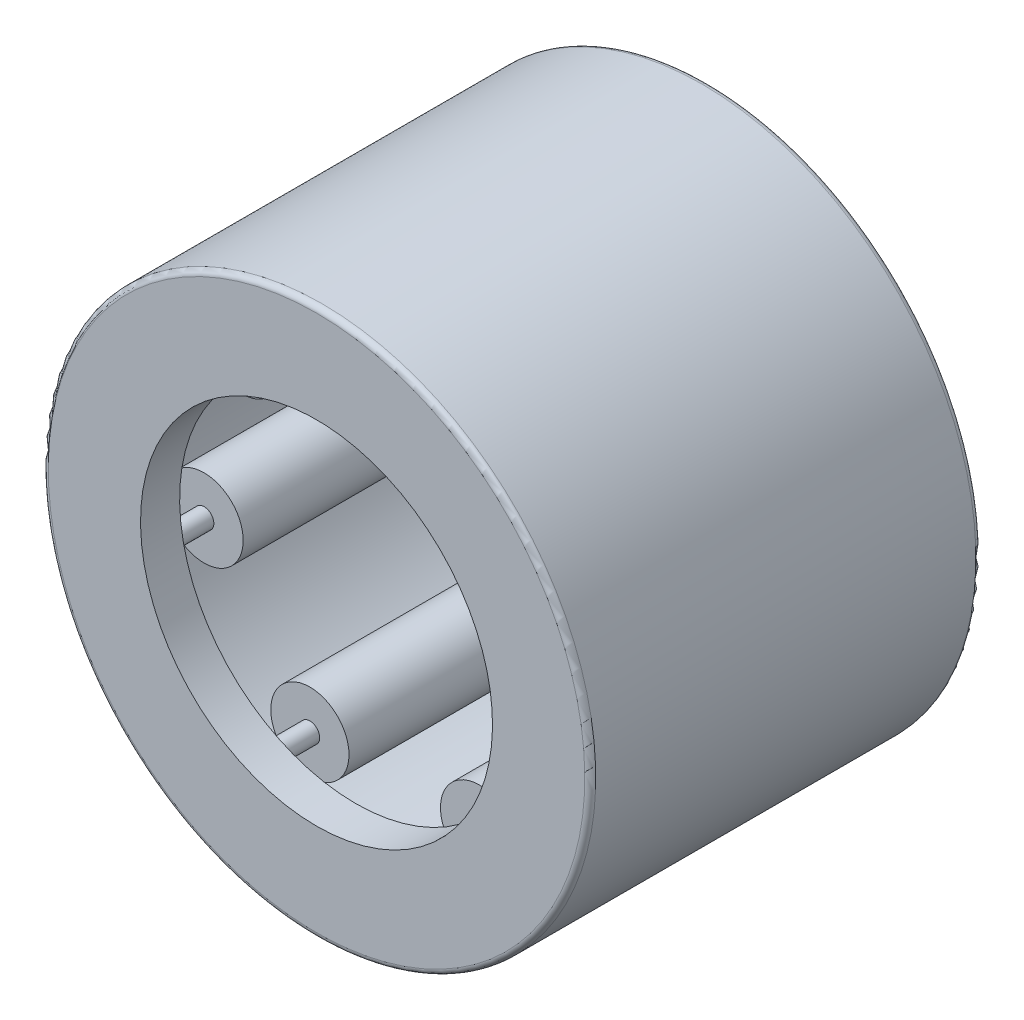
ISO-10303-21;
HEADER;
FILE_DESCRIPTION(('STEP AP214'),'2;1');
FILE_NAME('part.step','',(''),(''),'','','');
FILE_SCHEMA(('AUTOMOTIVE_DESIGN { 1 0 10303 214 1 1 1 1 }'));
ENDSEC;
DATA;
#1=APPLICATION_CONTEXT('core data for automotive mechanical design processes');
#2=APPLICATION_PROTOCOL_DEFINITION('international standard','automotive_design',2000,#1);
#3=PRODUCT_CONTEXT('',#1,'mechanical');
#4=PRODUCT('Part','Part','',(#3));
#5=PRODUCT_RELATED_PRODUCT_CATEGORY('part','',(#4));
#6=PRODUCT_DEFINITION_FORMATION('','',#4);
#7=PRODUCT_DEFINITION_CONTEXT('part definition',#1,'design');
#8=PRODUCT_DEFINITION('design','',#6,#7);
#9=PRODUCT_DEFINITION_SHAPE('','',#8);
#10=(LENGTH_UNIT() NAMED_UNIT(*) SI_UNIT(.MILLI.,.METRE.));
#11=(NAMED_UNIT(*) PLANE_ANGLE_UNIT() SI_UNIT($,.RADIAN.));
#12=(NAMED_UNIT(*) SI_UNIT($,.STERADIAN.) SOLID_ANGLE_UNIT());
#13=UNCERTAINTY_MEASURE_WITH_UNIT(LENGTH_MEASURE(1.E-05),#10,'distance_accuracy_value','');
#14=(GEOMETRIC_REPRESENTATION_CONTEXT(3) GLOBAL_UNCERTAINTY_ASSIGNED_CONTEXT((#13)) GLOBAL_UNIT_ASSIGNED_CONTEXT((#10,
#11,#12)) REPRESENTATION_CONTEXT('',''));
#15=CARTESIAN_POINT('',(0.,0.,0.));
#16=DIRECTION('',(0.,0.,1.));
#17=DIRECTION('',(1.,0.,0.));
#18=AXIS2_PLACEMENT_3D('',#15,#16,#17);
#19=CARTESIAN_POINT('',(-3.10289369604497,2.47447515112689,3.175));
#20=DIRECTION('',(0.,0.,-1.));
#21=DIRECTION('',(-0.623489801858743,-0.781831482468022,0.));
#22=AXIS2_PLACEMENT_3D('',#19,#20,#21);
#23=PLANE('',#22);
#24=CARTESIAN_POINT('',(-3.10289369604497,2.47447515112689,3.175));
#25=DIRECTION('',(0.,0.,1.));
#26=DIRECTION('',(0.623489801858743,0.781831482468022,0.));
#27=AXIS2_PLACEMENT_3D('',#24,#25,#26);
#28=CIRCLE('',#27,0.198437500000002);
#29=CARTESIAN_POINT('',(-2.97916993848862,2.62961983592914,3.175));
#30=VERTEX_POINT('',#29);
#31=EDGE_CURVE('E11',#30,#30,#28,.T.);
#32=ORIENTED_EDGE('',*,*,#31,.T.);
#33=EDGE_LOOP('',(#32));
#34=FACE_BOUND('',#33,.T.);
#35=ADVANCED_FACE('F41',(#34),#23,.F.);
#36=CARTESIAN_POINT('',(-3.10289369604497,2.47447515112689,3.175));
#37=DIRECTION('',(0.,0.,1.));
#38=DIRECTION('',(0.623489801858743,0.781831482468022,0.));
#39=AXIS2_PLACEMENT_3D('',#36,#37,#38);
#40=CYLINDRICAL_SURFACE('',#39,0.198437500000002);
#41=ORIENTED_EDGE('',*,*,#31,.F.);
#42=EDGE_LOOP('',(#41));
#43=FACE_BOUND('',#42,.T.);
#44=CARTESIAN_POINT('',(-3.10289369604497,2.47447515112689,-3.175));
#45=DIRECTION('',(0.,0.,1.));
#46=DIRECTION('',(0.623489801858743,0.781831482468022,0.));
#47=AXIS2_PLACEMENT_3D('',#44,#45,#46);
#48=CIRCLE('',#47,0.198437500000002);
#49=CARTESIAN_POINT('',(-2.97916993848862,2.62961983592914,-3.175));
#50=VERTEX_POINT('',#49);
#51=EDGE_CURVE('E47',#50,#50,#48,.T.);
#52=ORIENTED_EDGE('',*,*,#51,.T.);
#53=EDGE_LOOP('',(#52));
#54=FACE_BOUND('',#53,.T.);
#55=ADVANCED_FACE('F53',(#43,#54),#40,.T.);
#56=CARTESIAN_POINT('',(-3.10289369604497,2.47447515112689,-3.175));
#57=DIRECTION('',(0.,0.,1.));
#58=DIRECTION('',(0.623489801858743,0.781831482468022,0.));
#59=AXIS2_PLACEMENT_3D('',#56,#57,#58);
#60=PLANE('',#59);
#61=ORIENTED_EDGE('',*,*,#51,.F.);
#62=EDGE_LOOP('',(#61));
#63=FACE_BOUND('',#62,.T.);
#64=ADVANCED_FACE('F55',(#63),#60,.F.);
#65=CLOSED_SHELL('',(#35,#55,#64));
#66=MANIFOLD_SOLID_BREP('B2',#65);
#67=CARTESIAN_POINT('',(-3.86924515147163,-0.883129956639087,3.175));
#68=DIRECTION('',(0.,0.,-1.));
#69=DIRECTION('',(0.222520933956305,-0.974927912181826,0.));
#70=AXIS2_PLACEMENT_3D('',#67,#68,#69);
#71=PLANE('',#70);
#72=CARTESIAN_POINT('',(-3.86924515147163,-0.883129956639087,3.175));
#73=DIRECTION('',(0.,0.,1.));
#74=DIRECTION('',(-0.222520933956305,0.974927912181826,0.));
#75=AXIS2_PLACEMENT_3D('',#72,#73,#74);
#76=CIRCLE('',#75,0.198437500000002);
#77=CARTESIAN_POINT('',(-3.91340164930358,-0.689667699065504,3.175));
#78=VERTEX_POINT('',#77);
#79=EDGE_CURVE('E40',#78,#78,#76,.T.);
#80=ORIENTED_EDGE('',*,*,#79,.T.);
#81=EDGE_LOOP('',(#80));
#82=FACE_BOUND('',#81,.T.);
#83=ADVANCED_FACE('F89',(#82),#71,.F.);
#84=CARTESIAN_POINT('',(-3.86924515147163,-0.883129956639087,3.175));
#85=DIRECTION('',(0.,0.,1.));
#86=DIRECTION('',(-0.222520933956305,0.974927912181826,0.));
#87=AXIS2_PLACEMENT_3D('',#84,#85,#86);
#88=CYLINDRICAL_SURFACE('',#87,0.198437500000002);
#89=ORIENTED_EDGE('',*,*,#79,.F.);
#90=EDGE_LOOP('',(#89));
#91=FACE_BOUND('',#90,.T.);
#92=CARTESIAN_POINT('',(-3.86924515147163,-0.883129956639087,-3.175));
#93=DIRECTION('',(0.,0.,1.));
#94=DIRECTION('',(-0.222520933956305,0.974927912181826,0.));
#95=AXIS2_PLACEMENT_3D('',#92,#93,#94);
#96=CIRCLE('',#95,0.198437500000002);
#97=CARTESIAN_POINT('',(-3.91340164930358,-0.689667699065504,-3.175));
#98=VERTEX_POINT('',#97);
#99=EDGE_CURVE('E95',#98,#98,#96,.T.);
#100=ORIENTED_EDGE('',*,*,#99,.T.);
#101=EDGE_LOOP('',(#100));
#102=FACE_BOUND('',#101,.T.);
#103=ADVANCED_FACE('F101',(#91,#102),#88,.T.);
#104=CARTESIAN_POINT('',(-3.86924515147163,-0.883129956639087,-3.175));
#105=DIRECTION('',(0.,0.,1.));
#106=DIRECTION('',(-0.222520933956305,0.974927912181826,0.));
#107=AXIS2_PLACEMENT_3D('',#104,#105,#106);
#108=PLANE('',#107);
#109=ORIENTED_EDGE('',*,*,#99,.F.);
#110=EDGE_LOOP('',(#109));
#111=FACE_BOUND('',#110,.T.);
#112=ADVANCED_FACE('F103',(#111),#108,.F.);
#113=CLOSED_SHELL('',(#83,#103,#112));
#114=MANIFOLD_SOLID_BREP('B6',#113);
#115=CARTESIAN_POINT('',(-1.72197608962284,-3.57572019448772,3.175));
#116=DIRECTION('',(0.,0.,-1.));
#117=DIRECTION('',(0.900968867902416,-0.433883739117565,0.));
#118=AXIS2_PLACEMENT_3D('',#115,#116,#117);
#119=PLANE('',#118);
#120=CARTESIAN_POINT('',(-1.72197608962284,-3.57572019448772,3.175));
#121=DIRECTION('',(0.,0.,1.));
#122=DIRECTION('',(-0.900968867902416,0.433883739117565,0.));
#123=AXIS2_PLACEMENT_3D('',#120,#121,#122);
#124=CIRCLE('',#123,0.198437500000002);
#125=CARTESIAN_POINT('',(-1.90076209934723,-3.48962139000658,3.175));
#126=VERTEX_POINT('',#125);
#127=EDGE_CURVE('E88',#126,#126,#124,.T.);
#128=ORIENTED_EDGE('',*,*,#127,.T.);
#129=EDGE_LOOP('',(#128));
#130=FACE_BOUND('',#129,.T.);
#131=ADVANCED_FACE('F137',(#130),#119,.F.);
#132=CARTESIAN_POINT('',(-1.72197608962284,-3.57572019448772,3.175));
#133=DIRECTION('',(0.,0.,1.));
#134=DIRECTION('',(-0.900968867902416,0.433883739117565,0.));
#135=AXIS2_PLACEMENT_3D('',#132,#133,#134);
#136=CYLINDRICAL_SURFACE('',#135,0.198437500000002);
#137=ORIENTED_EDGE('',*,*,#127,.F.);
#138=EDGE_LOOP('',(#137));
#139=FACE_BOUND('',#138,.T.);
#140=CARTESIAN_POINT('',(-1.72197608962284,-3.57572019448772,-3.175));
#141=DIRECTION('',(0.,0.,1.));
#142=DIRECTION('',(-0.900968867902416,0.433883739117565,0.));
#143=AXIS2_PLACEMENT_3D('',#140,#141,#142);
#144=CIRCLE('',#143,0.198437500000002);
#145=CARTESIAN_POINT('',(-1.90076209934723,-3.48962139000658,-3.175));
#146=VERTEX_POINT('',#145);
#147=EDGE_CURVE('E143',#146,#146,#144,.T.);
#148=ORIENTED_EDGE('',*,*,#147,.T.);
#149=EDGE_LOOP('',(#148));
#150=FACE_BOUND('',#149,.T.);
#151=ADVANCED_FACE('F149',(#139,#150),#136,.T.);
#152=CARTESIAN_POINT('',(-1.72197608962284,-3.57572019448772,-3.175));
#153=DIRECTION('',(0.,0.,1.));
#154=DIRECTION('',(-0.900968867902416,0.433883739117565,0.));
#155=AXIS2_PLACEMENT_3D('',#152,#153,#154);
#156=PLANE('',#155);
#157=ORIENTED_EDGE('',*,*,#147,.F.);
#158=EDGE_LOOP('',(#157));
#159=FACE_BOUND('',#158,.T.);
#160=ADVANCED_FACE('F151',(#159),#156,.F.);
#161=CLOSED_SHELL('',(#131,#151,#160));
#162=MANIFOLD_SOLID_BREP('B35',#161);
#163=CARTESIAN_POINT('',(1.72197608962279,-3.57572019448774,3.175));
#164=DIRECTION('',(0.,0.,-1.));
#165=DIRECTION('',(0.900968867902422,0.433883739117553,0.));
#166=AXIS2_PLACEMENT_3D('',#163,#164,#165);
#167=PLANE('',#166);
#168=CARTESIAN_POINT('',(1.72197608962279,-3.57572019448774,3.175));
#169=DIRECTION('',(0.,0.,1.));
#170=DIRECTION('',(-0.900968867902422,-0.433883739117553,0.));
#171=AXIS2_PLACEMENT_3D('',#168,#169,#170);
#172=CIRCLE('',#171,0.198437500000002);
#173=CARTESIAN_POINT('',(1.5431900798984,-3.66181899896888,3.175));
#174=VERTEX_POINT('',#173);
#175=EDGE_CURVE('E136',#174,#174,#172,.T.);
#176=ORIENTED_EDGE('',*,*,#175,.T.);
#177=EDGE_LOOP('',(#176));
#178=FACE_BOUND('',#177,.T.);
#179=ADVANCED_FACE('F185',(#178),#167,.F.);
#180=CARTESIAN_POINT('',(1.72197608962279,-3.57572019448774,3.175));
#181=DIRECTION('',(0.,0.,1.));
#182=DIRECTION('',(-0.900968867902422,-0.433883739117553,0.));
#183=AXIS2_PLACEMENT_3D('',#180,#181,#182);
#184=CYLINDRICAL_SURFACE('',#183,0.198437500000002);
#185=ORIENTED_EDGE('',*,*,#175,.F.);
#186=EDGE_LOOP('',(#185));
#187=FACE_BOUND('',#186,.T.);
#188=CARTESIAN_POINT('',(1.72197608962279,-3.57572019448774,-3.175));
#189=DIRECTION('',(0.,0.,1.));
#190=DIRECTION('',(-0.900968867902422,-0.433883739117553,0.));
#191=AXIS2_PLACEMENT_3D('',#188,#189,#190);
#192=CIRCLE('',#191,0.198437500000002);
#193=CARTESIAN_POINT('',(1.5431900798984,-3.66181899896888,-3.175));
#194=VERTEX_POINT('',#193);
#195=EDGE_CURVE('E191',#194,#194,#192,.T.);
#196=ORIENTED_EDGE('',*,*,#195,.T.);
#197=EDGE_LOOP('',(#196));
#198=FACE_BOUND('',#197,.T.);
#199=ADVANCED_FACE('F197',(#187,#198),#184,.T.);
#200=CARTESIAN_POINT('',(1.72197608962279,-3.57572019448774,-3.175));
#201=DIRECTION('',(0.,0.,1.));
#202=DIRECTION('',(-0.900968867902422,-0.433883739117553,0.));
#203=AXIS2_PLACEMENT_3D('',#200,#201,#202);
#204=PLANE('',#203);
#205=ORIENTED_EDGE('',*,*,#195,.F.);
#206=EDGE_LOOP('',(#205));
#207=FACE_BOUND('',#206,.T.);
#208=ADVANCED_FACE('F199',(#207),#204,.F.);
#209=CLOSED_SHELL('',(#179,#199,#208));
#210=MANIFOLD_SOLID_BREP('B83',#209);
#211=CARTESIAN_POINT('',(3.86924515147162,-0.88312995663914,3.175));
#212=DIRECTION('',(0.,0.,-1.));
#213=DIRECTION('',(0.222520933956318,0.974927912181823,0.));
#214=AXIS2_PLACEMENT_3D('',#211,#212,#213);
#215=PLANE('',#214);
#216=CARTESIAN_POINT('',(3.86924515147162,-0.88312995663914,3.175));
#217=DIRECTION('',(0.,0.,1.));
#218=DIRECTION('',(-0.222520933956318,-0.974927912181823,0.));
#219=AXIS2_PLACEMENT_3D('',#216,#217,#218);
#220=CIRCLE('',#219,0.198437500000002);
#221=CARTESIAN_POINT('',(3.82508865363966,-1.07659221421272,3.175));
#222=VERTEX_POINT('',#221);
#223=EDGE_CURVE('E184',#222,#222,#220,.T.);
#224=ORIENTED_EDGE('',*,*,#223,.T.);
#225=EDGE_LOOP('',(#224));
#226=FACE_BOUND('',#225,.T.);
#227=ADVANCED_FACE('F233',(#226),#215,.F.);
#228=CARTESIAN_POINT('',(3.86924515147162,-0.88312995663914,3.175));
#229=DIRECTION('',(0.,0.,1.));
#230=DIRECTION('',(-0.222520933956318,-0.974927912181823,0.));
#231=AXIS2_PLACEMENT_3D('',#228,#229,#230);
#232=CYLINDRICAL_SURFACE('',#231,0.198437500000002);
#233=ORIENTED_EDGE('',*,*,#223,.F.);
#234=EDGE_LOOP('',(#233));
#235=FACE_BOUND('',#234,.T.);
#236=CARTESIAN_POINT('',(3.86924515147162,-0.88312995663914,-3.175));
#237=DIRECTION('',(0.,0.,1.));
#238=DIRECTION('',(-0.222520933956318,-0.974927912181823,0.));
#239=AXIS2_PLACEMENT_3D('',#236,#237,#238);
#240=CIRCLE('',#239,0.198437500000002);
#241=CARTESIAN_POINT('',(3.82508865363966,-1.07659221421272,-3.175));
#242=VERTEX_POINT('',#241);
#243=EDGE_CURVE('E239',#242,#242,#240,.T.);
#244=ORIENTED_EDGE('',*,*,#243,.T.);
#245=EDGE_LOOP('',(#244));
#246=FACE_BOUND('',#245,.T.);
#247=ADVANCED_FACE('F245',(#235,#246),#232,.T.);
#248=CARTESIAN_POINT('',(3.86924515147162,-0.88312995663914,-3.175));
#249=DIRECTION('',(0.,0.,1.));
#250=DIRECTION('',(-0.222520933956318,-0.974927912181823,0.));
#251=AXIS2_PLACEMENT_3D('',#248,#249,#250);
#252=PLANE('',#251);
#253=ORIENTED_EDGE('',*,*,#243,.F.);
#254=EDGE_LOOP('',(#253));
#255=FACE_BOUND('',#254,.T.);
#256=ADVANCED_FACE('F247',(#255),#252,.F.);
#257=CLOSED_SHELL('',(#227,#247,#256));
#258=MANIFOLD_SOLID_BREP('B131',#257);
#259=CARTESIAN_POINT('',(3.102893696045,2.47447515112685,3.175));
#260=DIRECTION('',(0.,0.,-1.));
#261=DIRECTION('',(-0.623489801858732,0.781831482468031,0.));
#262=AXIS2_PLACEMENT_3D('',#259,#260,#261);
#263=PLANE('',#262);
#264=CARTESIAN_POINT('',(3.102893696045,2.47447515112685,3.175));
#265=DIRECTION('',(0.,0.,1.));
#266=DIRECTION('',(0.623489801858732,-0.781831482468031,0.));
#267=AXIS2_PLACEMENT_3D('',#264,#265,#266);
#268=CIRCLE('',#267,0.198437500000002);
#269=CARTESIAN_POINT('',(3.22661745360135,2.3193304663246,3.175));
#270=VERTEX_POINT('',#269);
#271=EDGE_CURVE('E232',#270,#270,#268,.T.);
#272=ORIENTED_EDGE('',*,*,#271,.T.);
#273=EDGE_LOOP('',(#272));
#274=FACE_BOUND('',#273,.T.);
#275=ADVANCED_FACE('F281',(#274),#263,.F.);
#276=CARTESIAN_POINT('',(3.102893696045,2.47447515112685,3.175));
#277=DIRECTION('',(0.,0.,1.));
#278=DIRECTION('',(0.623489801858732,-0.781831482468031,0.));
#279=AXIS2_PLACEMENT_3D('',#276,#277,#278);
#280=CYLINDRICAL_SURFACE('',#279,0.198437500000002);
#281=ORIENTED_EDGE('',*,*,#271,.F.);
#282=EDGE_LOOP('',(#281));
#283=FACE_BOUND('',#282,.T.);
#284=CARTESIAN_POINT('',(3.102893696045,2.47447515112685,-3.175));
#285=DIRECTION('',(0.,0.,1.));
#286=DIRECTION('',(0.623489801858732,-0.781831482468031,0.));
#287=AXIS2_PLACEMENT_3D('',#284,#285,#286);
#288=CIRCLE('',#287,0.198437500000002);
#289=CARTESIAN_POINT('',(3.22661745360135,2.3193304663246,-3.175));
#290=VERTEX_POINT('',#289);
#291=EDGE_CURVE('E287',#290,#290,#288,.T.);
#292=ORIENTED_EDGE('',*,*,#291,.T.);
#293=EDGE_LOOP('',(#292));
#294=FACE_BOUND('',#293,.T.);
#295=ADVANCED_FACE('F293',(#283,#294),#280,.T.);
#296=CARTESIAN_POINT('',(3.102893696045,2.47447515112685,-3.175));
#297=DIRECTION('',(0.,0.,1.));
#298=DIRECTION('',(0.623489801858732,-0.781831482468031,0.));
#299=AXIS2_PLACEMENT_3D('',#296,#297,#298);
#300=PLANE('',#299);
#301=ORIENTED_EDGE('',*,*,#291,.F.);
#302=EDGE_LOOP('',(#301));
#303=FACE_BOUND('',#302,.T.);
#304=ADVANCED_FACE('F295',(#303),#300,.F.);
#305=CLOSED_SHELL('',(#275,#295,#304));
#306=MANIFOLD_SOLID_BREP('B179',#305);
#307=CARTESIAN_POINT('',(-3.72347243525396,2.96937018135227,-2.38125));
#308=DIRECTION('',(0.,0.,1.));
#309=DIRECTION('',(0.623489801858743,0.781831482468022,0.));
#310=AXIS2_PLACEMENT_3D('',#307,#308,#309);
#311=PLANE('',#310);
#312=CARTESIAN_POINT('',(-3.10289369604497,2.47447515112689,-2.38125));
#313=DIRECTION('',(0.,0.,1.));
#314=DIRECTION('',(0.623489801858743,0.781831482468022,0.));
#315=AXIS2_PLACEMENT_3D('',#312,#313,#314);
#316=CIRCLE('',#315,0.793749999999996);
#317=CARTESIAN_POINT('',(-2.60799866581959,3.09505389033588,-2.38125));
#318=VERTEX_POINT('',#317);
#319=EDGE_CURVE('E343',#318,#318,#316,.T.);
#320=ORIENTED_EDGE('',*,*,#319,.F.);
#321=EDGE_LOOP('',(#320));
#322=FACE_BOUND('',#321,.T.);
#323=CARTESIAN_POINT('',(-3.10289369604497,2.47447515112689,-2.38125));
#324=DIRECTION('',(0.,0.,1.));
#325=DIRECTION('',(0.623489801858743,0.781831482468022,0.));
#326=AXIS2_PLACEMENT_3D('',#323,#324,#325);
#327=CIRCLE('',#326,0.198437500000002);
#328=CARTESIAN_POINT('',(-2.97916993848862,2.62961983592914,-2.38125));
#329=VERTEX_POINT('',#328);
#330=EDGE_CURVE('E280',#329,#329,#327,.T.);
#331=ORIENTED_EDGE('',*,*,#330,.T.);
#332=EDGE_LOOP('',(#331));
#333=FACE_BOUND('',#332,.T.);
#334=ADVANCED_FACE('F329',(#322,#333),#311,.F.);
#335=CARTESIAN_POINT('',(-3.10289369604497,2.47447515112689,2.38125));
#336=DIRECTION('',(0.,0.,1.));
#337=DIRECTION('',(0.623489801858743,0.781831482468022,0.));
#338=AXIS2_PLACEMENT_3D('',#335,#336,#337);
#339=CYLINDRICAL_SURFACE('',#338,0.198437500000002);
#340=ORIENTED_EDGE('',*,*,#330,.F.);
#341=EDGE_LOOP('',(#340));
#342=FACE_BOUND('',#341,.T.);
#343=CARTESIAN_POINT('',(-3.10289369604497,2.47447515112689,2.38125));
#344=DIRECTION('',(0.,0.,1.));
#345=DIRECTION('',(0.623489801858743,0.781831482468022,0.));
#346=AXIS2_PLACEMENT_3D('',#343,#344,#345);
#347=CIRCLE('',#346,0.198437500000002);
#348=CARTESIAN_POINT('',(-2.97916993848862,2.62961983592914,2.38125));
#349=VERTEX_POINT('',#348);
#350=EDGE_CURVE('E335',#349,#349,#347,.T.);
#351=ORIENTED_EDGE('',*,*,#350,.T.);
#352=EDGE_LOOP('',(#351));
#353=FACE_BOUND('',#352,.T.);
#354=ADVANCED_FACE('F352',(#342,#353),#339,.F.);
#355=CARTESIAN_POINT('',(-3.72347243525396,2.96937018135227,2.38125));
#356=DIRECTION('',(0.,0.,-1.));
#357=DIRECTION('',(-0.623489801858743,-0.781831482468022,0.));
#358=AXIS2_PLACEMENT_3D('',#355,#356,#357);
#359=PLANE('',#358);
#360=ORIENTED_EDGE('',*,*,#350,.F.);
#361=EDGE_LOOP('',(#360));
#362=FACE_BOUND('',#361,.T.);
#363=CARTESIAN_POINT('',(-3.10289369604497,2.47447515112689,2.38125));
#364=DIRECTION('',(0.,0.,1.));
#365=DIRECTION('',(0.623489801858743,0.781831482468022,0.));
#366=AXIS2_PLACEMENT_3D('',#363,#364,#365);
#367=CIRCLE('',#366,0.793749999999996);
#368=CARTESIAN_POINT('',(-2.60799866581959,3.09505389033588,2.38125));
#369=VERTEX_POINT('',#368);
#370=EDGE_CURVE('E339',#369,#369,#367,.T.);
#371=ORIENTED_EDGE('',*,*,#370,.T.);
#372=EDGE_LOOP('',(#371));
#373=FACE_BOUND('',#372,.T.);
#374=ADVANCED_FACE('F356',(#362,#373),#359,.F.);
#375=CARTESIAN_POINT('',(-3.10289369604497,2.47447515112689,2.38125));
#376=DIRECTION('',(0.,0.,1.));
#377=DIRECTION('',(0.623489801858743,0.781831482468022,0.));
#378=AXIS2_PLACEMENT_3D('',#375,#376,#377);
#379=CYLINDRICAL_SURFACE('',#378,0.793749999999996);
#380=ORIENTED_EDGE('',*,*,#370,.F.);
#381=EDGE_LOOP('',(#380));
#382=FACE_BOUND('',#381,.T.);
#383=ORIENTED_EDGE('',*,*,#319,.T.);
#384=EDGE_LOOP('',(#383));
#385=FACE_BOUND('',#384,.T.);
#386=ADVANCED_FACE('F349',(#382,#385),#379,.T.);
#387=CLOSED_SHELL('',(#334,#354,#374,#386));
#388=MANIFOLD_SOLID_BREP('B227',#387);
#389=CARTESIAN_POINT('',(-4.64309418176595,-1.0597559479669,-2.38125));
#390=DIRECTION('',(0.,0.,1.));
#391=DIRECTION('',(-0.222520933956305,0.974927912181826,0.));
#392=AXIS2_PLACEMENT_3D('',#389,#390,#391);
#393=PLANE('',#392);
#394=CARTESIAN_POINT('',(-3.86924515147163,-0.883129956639087,-2.38125));
#395=DIRECTION('',(0.,0.,1.));
#396=DIRECTION('',(-0.222520933956305,0.974927912181826,0.));
#397=AXIS2_PLACEMENT_3D('',#394,#395,#396);
#398=CIRCLE('',#397,0.793749999999996);
#399=CARTESIAN_POINT('',(-4.04587114279944,-0.109280926344767,-2.38125));
#400=VERTEX_POINT('',#399);
#401=EDGE_CURVE('E412',#400,#400,#398,.T.);
#402=ORIENTED_EDGE('',*,*,#401,.F.);
#403=EDGE_LOOP('',(#402));
#404=FACE_BOUND('',#403,.T.);
#405=CARTESIAN_POINT('',(-3.86924515147163,-0.883129956639087,-2.38125));
#406=DIRECTION('',(0.,0.,1.));
#407=DIRECTION('',(-0.222520933956305,0.974927912181826,0.));
#408=AXIS2_PLACEMENT_3D('',#405,#406,#407);
#409=CIRCLE('',#408,0.198437500000002);
#410=CARTESIAN_POINT('',(-3.91340164930358,-0.689667699065504,-2.38125));
#411=VERTEX_POINT('',#410);
#412=EDGE_CURVE('E328',#411,#411,#409,.T.);
#413=ORIENTED_EDGE('',*,*,#412,.T.);
#414=EDGE_LOOP('',(#413));
#415=FACE_BOUND('',#414,.T.);
#416=ADVANCED_FACE('F398',(#404,#415),#393,.F.);
#417=CARTESIAN_POINT('',(-3.86924515147163,-0.883129956639087,2.38125));
#418=DIRECTION('',(0.,0.,1.));
#419=DIRECTION('',(-0.222520933956305,0.974927912181826,0.));
#420=AXIS2_PLACEMENT_3D('',#417,#418,#419);
#421=CYLINDRICAL_SURFACE('',#420,0.198437500000002);
#422=ORIENTED_EDGE('',*,*,#412,.F.);
#423=EDGE_LOOP('',(#422));
#424=FACE_BOUND('',#423,.T.);
#425=CARTESIAN_POINT('',(-3.86924515147163,-0.883129956639087,2.38125));
#426=DIRECTION('',(0.,0.,1.));
#427=DIRECTION('',(-0.222520933956305,0.974927912181826,0.));
#428=AXIS2_PLACEMENT_3D('',#425,#426,#427);
#429=CIRCLE('',#428,0.198437500000002);
#430=CARTESIAN_POINT('',(-3.91340164930358,-0.689667699065504,2.38125));
#431=VERTEX_POINT('',#430);
#432=EDGE_CURVE('E404',#431,#431,#429,.T.);
#433=ORIENTED_EDGE('',*,*,#432,.T.);
#434=EDGE_LOOP('',(#433));
#435=FACE_BOUND('',#434,.T.);
#436=ADVANCED_FACE('F421',(#424,#435),#421,.F.);
#437=CARTESIAN_POINT('',(-4.64309418176595,-1.0597559479669,2.38125));
#438=DIRECTION('',(0.,0.,-1.));
#439=DIRECTION('',(0.222520933956305,-0.974927912181826,0.));
#440=AXIS2_PLACEMENT_3D('',#437,#438,#439);
#441=PLANE('',#440);
#442=ORIENTED_EDGE('',*,*,#432,.F.);
#443=EDGE_LOOP('',(#442));
#444=FACE_BOUND('',#443,.T.);
#445=CARTESIAN_POINT('',(-3.86924515147163,-0.883129956639087,2.38125));
#446=DIRECTION('',(0.,0.,1.));
#447=DIRECTION('',(-0.222520933956305,0.974927912181826,0.));
#448=AXIS2_PLACEMENT_3D('',#445,#446,#447);
#449=CIRCLE('',#448,0.793749999999996);
#450=CARTESIAN_POINT('',(-4.04587114279944,-0.109280926344767,2.38125));
#451=VERTEX_POINT('',#450);
#452=EDGE_CURVE('E408',#451,#451,#449,.T.);
#453=ORIENTED_EDGE('',*,*,#452,.T.);
#454=EDGE_LOOP('',(#453));
#455=FACE_BOUND('',#454,.T.);
#456=ADVANCED_FACE('F425',(#444,#455),#441,.F.);
#457=CARTESIAN_POINT('',(-3.86924515147163,-0.883129956639087,2.38125));
#458=DIRECTION('',(0.,0.,1.));
#459=DIRECTION('',(-0.222520933956305,0.974927912181826,0.));
#460=AXIS2_PLACEMENT_3D('',#457,#458,#459);
#461=CYLINDRICAL_SURFACE('',#460,0.793749999999996);
#462=ORIENTED_EDGE('',*,*,#452,.F.);
#463=EDGE_LOOP('',(#462));
#464=FACE_BOUND('',#463,.T.);
#465=ORIENTED_EDGE('',*,*,#401,.T.);
#466=EDGE_LOOP('',(#465));
#467=FACE_BOUND('',#466,.T.);
#468=ADVANCED_FACE('F418',(#464,#467),#461,.T.);
#469=CLOSED_SHELL('',(#416,#436,#456,#468));
#470=MANIFOLD_SOLID_BREP('B275',#469);
#471=CARTESIAN_POINT('',(-2.06637130754741,-4.29086423338526,-2.38125));
#472=DIRECTION('',(0.,0.,1.));
#473=DIRECTION('',(-0.900968867902416,0.433883739117565,0.));
#474=AXIS2_PLACEMENT_3D('',#471,#472,#473);
#475=PLANE('',#474);
#476=CARTESIAN_POINT('',(-1.72197608962284,-3.57572019448772,-2.38125));
#477=DIRECTION('',(0.,0.,1.));
#478=DIRECTION('',(-0.900968867902416,0.433883739117565,0.));
#479=AXIS2_PLACEMENT_3D('',#476,#477,#478);
#480=CIRCLE('',#479,0.793749999999996);
#481=CARTESIAN_POINT('',(-2.43712012852038,-3.23132497656315,-2.38125));
#482=VERTEX_POINT('',#481);
#483=EDGE_CURVE('E481',#482,#482,#480,.T.);
#484=ORIENTED_EDGE('',*,*,#483,.F.);
#485=EDGE_LOOP('',(#484));
#486=FACE_BOUND('',#485,.T.);
#487=CARTESIAN_POINT('',(-1.72197608962284,-3.57572019448772,-2.38125));
#488=DIRECTION('',(0.,0.,1.));
#489=DIRECTION('',(-0.900968867902416,0.433883739117565,0.));
#490=AXIS2_PLACEMENT_3D('',#487,#488,#489);
#491=CIRCLE('',#490,0.198437500000002);
#492=CARTESIAN_POINT('',(-1.90076209934723,-3.48962139000658,-2.38125));
#493=VERTEX_POINT('',#492);
#494=EDGE_CURVE('E397',#493,#493,#491,.T.);
#495=ORIENTED_EDGE('',*,*,#494,.T.);
#496=EDGE_LOOP('',(#495));
#497=FACE_BOUND('',#496,.T.);
#498=ADVANCED_FACE('F467',(#486,#497),#475,.F.);
#499=CARTESIAN_POINT('',(-1.72197608962284,-3.57572019448772,2.38125));
#500=DIRECTION('',(0.,0.,1.));
#501=DIRECTION('',(-0.900968867902416,0.433883739117565,0.));
#502=AXIS2_PLACEMENT_3D('',#499,#500,#501);
#503=CYLINDRICAL_SURFACE('',#502,0.198437500000002);
#504=ORIENTED_EDGE('',*,*,#494,.F.);
#505=EDGE_LOOP('',(#504));
#506=FACE_BOUND('',#505,.T.);
#507=CARTESIAN_POINT('',(-1.72197608962284,-3.57572019448772,2.38125));
#508=DIRECTION('',(0.,0.,1.));
#509=DIRECTION('',(-0.900968867902416,0.433883739117565,0.));
#510=AXIS2_PLACEMENT_3D('',#507,#508,#509);
#511=CIRCLE('',#510,0.198437500000002);
#512=CARTESIAN_POINT('',(-1.90076209934723,-3.48962139000658,2.38125));
#513=VERTEX_POINT('',#512);
#514=EDGE_CURVE('E473',#513,#513,#511,.T.);
#515=ORIENTED_EDGE('',*,*,#514,.T.);
#516=EDGE_LOOP('',(#515));
#517=FACE_BOUND('',#516,.T.);
#518=ADVANCED_FACE('F490',(#506,#517),#503,.F.);
#519=CARTESIAN_POINT('',(-2.06637130754741,-4.29086423338526,2.38125));
#520=DIRECTION('',(0.,0.,-1.));
#521=DIRECTION('',(0.900968867902416,-0.433883739117565,0.));
#522=AXIS2_PLACEMENT_3D('',#519,#520,#521);
#523=PLANE('',#522);
#524=ORIENTED_EDGE('',*,*,#514,.F.);
#525=EDGE_LOOP('',(#524));
#526=FACE_BOUND('',#525,.T.);
#527=CARTESIAN_POINT('',(-1.72197608962284,-3.57572019448772,2.38125));
#528=DIRECTION('',(0.,0.,1.));
#529=DIRECTION('',(-0.900968867902416,0.433883739117565,0.));
#530=AXIS2_PLACEMENT_3D('',#527,#528,#529);
#531=CIRCLE('',#530,0.793749999999996);
#532=CARTESIAN_POINT('',(-2.43712012852038,-3.23132497656315,2.38125));
#533=VERTEX_POINT('',#532);
#534=EDGE_CURVE('E477',#533,#533,#531,.T.);
#535=ORIENTED_EDGE('',*,*,#534,.T.);
#536=EDGE_LOOP('',(#535));
#537=FACE_BOUND('',#536,.T.);
#538=ADVANCED_FACE('F494',(#526,#537),#523,.F.);
#539=CARTESIAN_POINT('',(-1.72197608962284,-3.57572019448772,2.38125));
#540=DIRECTION('',(0.,0.,1.));
#541=DIRECTION('',(-0.900968867902416,0.433883739117565,0.));
#542=AXIS2_PLACEMENT_3D('',#539,#540,#541);
#543=CYLINDRICAL_SURFACE('',#542,0.793749999999996);
#544=ORIENTED_EDGE('',*,*,#534,.F.);
#545=EDGE_LOOP('',(#544));
#546=FACE_BOUND('',#545,.T.);
#547=ORIENTED_EDGE('',*,*,#483,.T.);
#548=EDGE_LOOP('',(#547));
#549=FACE_BOUND('',#548,.T.);
#550=ADVANCED_FACE('F487',(#546,#549),#543,.T.);
#551=CLOSED_SHELL('',(#498,#518,#538,#550));
#552=MANIFOLD_SOLID_BREP('B323',#551);
#553=CARTESIAN_POINT('',(2.06637130754735,-4.29086423338529,-2.38125));
#554=DIRECTION('',(0.,0.,1.));
#555=DIRECTION('',(-0.900968867902422,-0.433883739117553,0.));
#556=AXIS2_PLACEMENT_3D('',#553,#554,#555);
#557=PLANE('',#556);
#558=CARTESIAN_POINT('',(1.72197608962279,-3.57572019448774,-2.38125));
#559=DIRECTION('',(0.,0.,1.));
#560=DIRECTION('',(-0.900968867902422,-0.433883739117553,0.));
#561=AXIS2_PLACEMENT_3D('',#558,#559,#560);
#562=CIRCLE('',#561,0.793749999999996);
#563=CARTESIAN_POINT('',(1.00683205072525,-3.9201154124123,-2.38125));
#564=VERTEX_POINT('',#563);
#565=EDGE_CURVE('E550',#564,#564,#562,.T.);
#566=ORIENTED_EDGE('',*,*,#565,.F.);
#567=EDGE_LOOP('',(#566));
#568=FACE_BOUND('',#567,.T.);
#569=CARTESIAN_POINT('',(1.72197608962279,-3.57572019448774,-2.38125));
#570=DIRECTION('',(0.,0.,1.));
#571=DIRECTION('',(-0.900968867902422,-0.433883739117553,0.));
#572=AXIS2_PLACEMENT_3D('',#569,#570,#571);
#573=CIRCLE('',#572,0.198437500000002);
#574=CARTESIAN_POINT('',(1.5431900798984,-3.66181899896888,-2.38125));
#575=VERTEX_POINT('',#574);
#576=EDGE_CURVE('E466',#575,#575,#573,.T.);
#577=ORIENTED_EDGE('',*,*,#576,.T.);
#578=EDGE_LOOP('',(#577));
#579=FACE_BOUND('',#578,.T.);
#580=ADVANCED_FACE('F536',(#568,#579),#557,.F.);
#581=CARTESIAN_POINT('',(1.72197608962279,-3.57572019448774,2.38125));
#582=DIRECTION('',(0.,0.,1.));
#583=DIRECTION('',(-0.900968867902422,-0.433883739117553,0.));
#584=AXIS2_PLACEMENT_3D('',#581,#582,#583);
#585=CYLINDRICAL_SURFACE('',#584,0.198437500000002);
#586=ORIENTED_EDGE('',*,*,#576,.F.);
#587=EDGE_LOOP('',(#586));
#588=FACE_BOUND('',#587,.T.);
#589=CARTESIAN_POINT('',(1.72197608962279,-3.57572019448774,2.38125));
#590=DIRECTION('',(0.,0.,1.));
#591=DIRECTION('',(-0.900968867902422,-0.433883739117553,0.));
#592=AXIS2_PLACEMENT_3D('',#589,#590,#591);
#593=CIRCLE('',#592,0.198437500000002);
#594=CARTESIAN_POINT('',(1.5431900798984,-3.66181899896888,2.38125));
#595=VERTEX_POINT('',#594);
#596=EDGE_CURVE('E542',#595,#595,#593,.T.);
#597=ORIENTED_EDGE('',*,*,#596,.T.);
#598=EDGE_LOOP('',(#597));
#599=FACE_BOUND('',#598,.T.);
#600=ADVANCED_FACE('F559',(#588,#599),#585,.F.);
#601=CARTESIAN_POINT('',(2.06637130754735,-4.29086423338529,2.38125));
#602=DIRECTION('',(0.,0.,-1.));
#603=DIRECTION('',(0.900968867902422,0.433883739117553,0.));
#604=AXIS2_PLACEMENT_3D('',#601,#602,#603);
#605=PLANE('',#604);
#606=ORIENTED_EDGE('',*,*,#596,.F.);
#607=EDGE_LOOP('',(#606));
#608=FACE_BOUND('',#607,.T.);
#609=CARTESIAN_POINT('',(1.72197608962279,-3.57572019448774,2.38125));
#610=DIRECTION('',(0.,0.,1.));
#611=DIRECTION('',(-0.900968867902422,-0.433883739117553,0.));
#612=AXIS2_PLACEMENT_3D('',#609,#610,#611);
#613=CIRCLE('',#612,0.793749999999996);
#614=CARTESIAN_POINT('',(1.00683205072525,-3.9201154124123,2.38125));
#615=VERTEX_POINT('',#614);
#616=EDGE_CURVE('E546',#615,#615,#613,.T.);
#617=ORIENTED_EDGE('',*,*,#616,.T.);
#618=EDGE_LOOP('',(#617));
#619=FACE_BOUND('',#618,.T.);
#620=ADVANCED_FACE('F563',(#608,#619),#605,.F.);
#621=CARTESIAN_POINT('',(1.72197608962279,-3.57572019448774,2.38125));
#622=DIRECTION('',(0.,0.,1.));
#623=DIRECTION('',(-0.900968867902422,-0.433883739117553,0.));
#624=AXIS2_PLACEMENT_3D('',#621,#622,#623);
#625=CYLINDRICAL_SURFACE('',#624,0.793749999999996);
#626=ORIENTED_EDGE('',*,*,#616,.F.);
#627=EDGE_LOOP('',(#626));
#628=FACE_BOUND('',#627,.T.);
#629=ORIENTED_EDGE('',*,*,#565,.T.);
#630=EDGE_LOOP('',(#629));
#631=FACE_BOUND('',#630,.T.);
#632=ADVANCED_FACE('F556',(#628,#631),#625,.T.);
#633=CLOSED_SHELL('',(#580,#600,#620,#632));
#634=MANIFOLD_SOLID_BREP('B392',#633);
#635=CARTESIAN_POINT('',(4.64309418176593,-1.05975594796697,-2.38125));
#636=DIRECTION('',(0.,0.,1.));
#637=DIRECTION('',(-0.222520933956318,-0.974927912181823,0.));
#638=AXIS2_PLACEMENT_3D('',#635,#636,#637);
#639=PLANE('',#638);
#640=CARTESIAN_POINT('',(3.86924515147162,-0.88312995663914,-2.38125));
#641=DIRECTION('',(0.,0.,1.));
#642=DIRECTION('',(-0.222520933956318,-0.974927912181823,0.));
#643=AXIS2_PLACEMENT_3D('',#640,#641,#642);
#644=CIRCLE('',#643,0.793749999999996);
#645=CARTESIAN_POINT('',(3.69261916014379,-1.65697898693346,-2.38125));
#646=VERTEX_POINT('',#645);
#647=EDGE_CURVE('E619',#646,#646,#644,.T.);
#648=ORIENTED_EDGE('',*,*,#647,.F.);
#649=EDGE_LOOP('',(#648));
#650=FACE_BOUND('',#649,.T.);
#651=CARTESIAN_POINT('',(3.86924515147162,-0.88312995663914,-2.38125));
#652=DIRECTION('',(0.,0.,1.));
#653=DIRECTION('',(-0.222520933956318,-0.974927912181823,0.));
#654=AXIS2_PLACEMENT_3D('',#651,#652,#653);
#655=CIRCLE('',#654,0.198437500000002);
#656=CARTESIAN_POINT('',(3.82508865363966,-1.07659221421272,-2.38125));
#657=VERTEX_POINT('',#656);
#658=EDGE_CURVE('E535',#657,#657,#655,.T.);
#659=ORIENTED_EDGE('',*,*,#658,.T.);
#660=EDGE_LOOP('',(#659));
#661=FACE_BOUND('',#660,.T.);
#662=ADVANCED_FACE('F605',(#650,#661),#639,.F.);
#663=CARTESIAN_POINT('',(3.86924515147162,-0.88312995663914,2.38125));
#664=DIRECTION('',(0.,0.,1.));
#665=DIRECTION('',(-0.222520933956318,-0.974927912181823,0.));
#666=AXIS2_PLACEMENT_3D('',#663,#664,#665);
#667=CYLINDRICAL_SURFACE('',#666,0.198437500000002);
#668=ORIENTED_EDGE('',*,*,#658,.F.);
#669=EDGE_LOOP('',(#668));
#670=FACE_BOUND('',#669,.T.);
#671=CARTESIAN_POINT('',(3.86924515147162,-0.88312995663914,2.38125));
#672=DIRECTION('',(0.,0.,1.));
#673=DIRECTION('',(-0.222520933956318,-0.974927912181823,0.));
#674=AXIS2_PLACEMENT_3D('',#671,#672,#673);
#675=CIRCLE('',#674,0.198437500000002);
#676=CARTESIAN_POINT('',(3.82508865363966,-1.07659221421272,2.38125));
#677=VERTEX_POINT('',#676);
#678=EDGE_CURVE('E611',#677,#677,#675,.T.);
#679=ORIENTED_EDGE('',*,*,#678,.T.);
#680=EDGE_LOOP('',(#679));
#681=FACE_BOUND('',#680,.T.);
#682=ADVANCED_FACE('F628',(#670,#681),#667,.F.);
#683=CARTESIAN_POINT('',(4.64309418176593,-1.05975594796697,2.38125));
#684=DIRECTION('',(0.,0.,-1.));
#685=DIRECTION('',(0.222520933956318,0.974927912181823,0.));
#686=AXIS2_PLACEMENT_3D('',#683,#684,#685);
#687=PLANE('',#686);
#688=ORIENTED_EDGE('',*,*,#678,.F.);
#689=EDGE_LOOP('',(#688));
#690=FACE_BOUND('',#689,.T.);
#691=CARTESIAN_POINT('',(3.86924515147162,-0.88312995663914,2.38125));
#692=DIRECTION('',(0.,0.,1.));
#693=DIRECTION('',(-0.222520933956318,-0.974927912181823,0.));
#694=AXIS2_PLACEMENT_3D('',#691,#692,#693);
#695=CIRCLE('',#694,0.793749999999996);
#696=CARTESIAN_POINT('',(3.69261916014379,-1.65697898693346,2.38125));
#697=VERTEX_POINT('',#696);
#698=EDGE_CURVE('E615',#697,#697,#695,.T.);
#699=ORIENTED_EDGE('',*,*,#698,.T.);
#700=EDGE_LOOP('',(#699));
#701=FACE_BOUND('',#700,.T.);
#702=ADVANCED_FACE('F632',(#690,#701),#687,.F.);
#703=CARTESIAN_POINT('',(3.86924515147162,-0.88312995663914,2.38125));
#704=DIRECTION('',(0.,0.,1.));
#705=DIRECTION('',(-0.222520933956318,-0.974927912181823,0.));
#706=AXIS2_PLACEMENT_3D('',#703,#704,#705);
#707=CYLINDRICAL_SURFACE('',#706,0.793749999999996);
#708=ORIENTED_EDGE('',*,*,#698,.F.);
#709=EDGE_LOOP('',(#708));
#710=FACE_BOUND('',#709,.T.);
#711=ORIENTED_EDGE('',*,*,#647,.T.);
#712=EDGE_LOOP('',(#711));
#713=FACE_BOUND('',#712,.T.);
#714=ADVANCED_FACE('F625',(#710,#713),#707,.T.);
#715=CLOSED_SHELL('',(#662,#682,#702,#714));
#716=MANIFOLD_SOLID_BREP('B461',#715);
#717=CARTESIAN_POINT('',(3.723472435254,2.96937018135221,-2.38125));
#718=DIRECTION('',(0.,0.,1.));
#719=DIRECTION('',(0.623489801858732,-0.781831482468031,0.));
#720=AXIS2_PLACEMENT_3D('',#717,#718,#719);
#721=PLANE('',#720);
#722=CARTESIAN_POINT('',(3.102893696045,2.47447515112685,-2.38125));
#723=DIRECTION('',(0.,0.,1.));
#724=DIRECTION('',(0.623489801858732,-0.781831482468031,0.));
#725=AXIS2_PLACEMENT_3D('',#722,#723,#724);
#726=CIRCLE('',#725,0.793749999999996);
#727=CARTESIAN_POINT('',(3.59778872627037,1.85389641191785,-2.38125));
#728=VERTEX_POINT('',#727);
#729=EDGE_CURVE('E688',#728,#728,#726,.T.);
#730=ORIENTED_EDGE('',*,*,#729,.F.);
#731=EDGE_LOOP('',(#730));
#732=FACE_BOUND('',#731,.T.);
#733=CARTESIAN_POINT('',(3.102893696045,2.47447515112685,-2.38125));
#734=DIRECTION('',(0.,0.,1.));
#735=DIRECTION('',(0.623489801858732,-0.781831482468031,0.));
#736=AXIS2_PLACEMENT_3D('',#733,#734,#735);
#737=CIRCLE('',#736,0.198437500000002);
#738=CARTESIAN_POINT('',(3.22661745360135,2.3193304663246,-2.38125));
#739=VERTEX_POINT('',#738);
#740=EDGE_CURVE('E604',#739,#739,#737,.T.);
#741=ORIENTED_EDGE('',*,*,#740,.T.);
#742=EDGE_LOOP('',(#741));
#743=FACE_BOUND('',#742,.T.);
#744=ADVANCED_FACE('F674',(#732,#743),#721,.F.);
#745=CARTESIAN_POINT('',(3.102893696045,2.47447515112685,2.38125));
#746=DIRECTION('',(0.,0.,1.));
#747=DIRECTION('',(0.623489801858732,-0.781831482468031,0.));
#748=AXIS2_PLACEMENT_3D('',#745,#746,#747);
#749=CYLINDRICAL_SURFACE('',#748,0.198437500000002);
#750=ORIENTED_EDGE('',*,*,#740,.F.);
#751=EDGE_LOOP('',(#750));
#752=FACE_BOUND('',#751,.T.);
#753=CARTESIAN_POINT('',(3.102893696045,2.47447515112685,2.38125));
#754=DIRECTION('',(0.,0.,1.));
#755=DIRECTION('',(0.623489801858732,-0.781831482468031,0.));
#756=AXIS2_PLACEMENT_3D('',#753,#754,#755);
#757=CIRCLE('',#756,0.198437500000002);
#758=CARTESIAN_POINT('',(3.22661745360135,2.3193304663246,2.38125));
#759=VERTEX_POINT('',#758);
#760=EDGE_CURVE('E680',#759,#759,#757,.T.);
#761=ORIENTED_EDGE('',*,*,#760,.T.);
#762=EDGE_LOOP('',(#761));
#763=FACE_BOUND('',#762,.T.);
#764=ADVANCED_FACE('F697',(#752,#763),#749,.F.);
#765=CARTESIAN_POINT('',(3.723472435254,2.96937018135221,2.38125));
#766=DIRECTION('',(0.,0.,-1.));
#767=DIRECTION('',(-0.623489801858732,0.781831482468031,0.));
#768=AXIS2_PLACEMENT_3D('',#765,#766,#767);
#769=PLANE('',#768);
#770=ORIENTED_EDGE('',*,*,#760,.F.);
#771=EDGE_LOOP('',(#770));
#772=FACE_BOUND('',#771,.T.);
#773=CARTESIAN_POINT('',(3.102893696045,2.47447515112685,2.38125));
#774=DIRECTION('',(0.,0.,1.));
#775=DIRECTION('',(0.623489801858732,-0.781831482468031,0.));
#776=AXIS2_PLACEMENT_3D('',#773,#774,#775);
#777=CIRCLE('',#776,0.793749999999996);
#778=CARTESIAN_POINT('',(3.59778872627037,1.85389641191785,2.38125));
#779=VERTEX_POINT('',#778);
#780=EDGE_CURVE('E684',#779,#779,#777,.T.);
#781=ORIENTED_EDGE('',*,*,#780,.T.);
#782=EDGE_LOOP('',(#781));
#783=FACE_BOUND('',#782,.T.);
#784=ADVANCED_FACE('F701',(#772,#783),#769,.F.);
#785=CARTESIAN_POINT('',(3.102893696045,2.47447515112685,2.38125));
#786=DIRECTION('',(0.,0.,1.));
#787=DIRECTION('',(0.623489801858732,-0.781831482468031,0.));
#788=AXIS2_PLACEMENT_3D('',#785,#786,#787);
#789=CYLINDRICAL_SURFACE('',#788,0.793749999999996);
#790=ORIENTED_EDGE('',*,*,#780,.F.);
#791=EDGE_LOOP('',(#790));
#792=FACE_BOUND('',#791,.T.);
#793=ORIENTED_EDGE('',*,*,#729,.T.);
#794=EDGE_LOOP('',(#793));
#795=FACE_BOUND('',#794,.T.);
#796=ADVANCED_FACE('F694',(#792,#795),#789,.T.);
#797=CLOSED_SHELL('',(#744,#764,#784,#796));
#798=MANIFOLD_SOLID_BREP('B530',#797);
#799=CARTESIAN_POINT('',(0.,3.96875000000001,3.175));
#800=DIRECTION('',(0.,0.,-1.));
#801=DIRECTION('',(-1.,0.,0.));
#802=AXIS2_PLACEMENT_3D('',#799,#800,#801);
#803=PLANE('',#802);
#804=CARTESIAN_POINT('',(0.,3.96875000000001,3.175));
#805=DIRECTION('',(0.,0.,1.));
#806=DIRECTION('',(1.,0.,0.));
#807=AXIS2_PLACEMENT_3D('',#804,#805,#806);
#808=CIRCLE('',#807,0.198437500000002);
#809=CARTESIAN_POINT('',(0.198437500000002,3.96875000000001,3.175));
#810=VERTEX_POINT('',#809);
#811=EDGE_CURVE('E673',#810,#810,#808,.T.);
#812=ORIENTED_EDGE('',*,*,#811,.T.);
#813=EDGE_LOOP('',(#812));
#814=FACE_BOUND('',#813,.T.);
#815=ADVANCED_FACE('F743',(#814),#803,.F.);
#816=CARTESIAN_POINT('',(0.,3.96875000000001,3.175));
#817=DIRECTION('',(0.,0.,1.));
#818=DIRECTION('',(1.,0.,0.));
#819=AXIS2_PLACEMENT_3D('',#816,#817,#818);
#820=CYLINDRICAL_SURFACE('',#819,0.198437500000002);
#821=ORIENTED_EDGE('',*,*,#811,.F.);
#822=EDGE_LOOP('',(#821));
#823=FACE_BOUND('',#822,.T.);
#824=CARTESIAN_POINT('',(0.,3.96875000000001,-3.175));
#825=DIRECTION('',(0.,0.,1.));
#826=DIRECTION('',(1.,0.,0.));
#827=AXIS2_PLACEMENT_3D('',#824,#825,#826);
#828=CIRCLE('',#827,0.198437500000002);
#829=CARTESIAN_POINT('',(0.198437500000002,3.96875000000001,-3.175));
#830=VERTEX_POINT('',#829);
#831=EDGE_CURVE('E749',#830,#830,#828,.T.);
#832=ORIENTED_EDGE('',*,*,#831,.T.);
#833=EDGE_LOOP('',(#832));
#834=FACE_BOUND('',#833,.T.);
#835=ADVANCED_FACE('F755',(#823,#834),#820,.T.);
#836=CARTESIAN_POINT('',(0.,3.96875000000001,-3.175));
#837=DIRECTION('',(0.,0.,1.));
#838=DIRECTION('',(1.,0.,0.));
#839=AXIS2_PLACEMENT_3D('',#836,#837,#838);
#840=PLANE('',#839);
#841=ORIENTED_EDGE('',*,*,#831,.F.);
#842=EDGE_LOOP('',(#841));
#843=FACE_BOUND('',#842,.T.);
#844=ADVANCED_FACE('F757',(#843),#840,.F.);
#845=CLOSED_SHELL('',(#815,#835,#844));
#846=MANIFOLD_SOLID_BREP('B599',#845);
#847=CARTESIAN_POINT('',(0.,4.7625,-2.38125));
#848=DIRECTION('',(0.,0.,1.));
#849=DIRECTION('',(1.,0.,0.));
#850=AXIS2_PLACEMENT_3D('',#847,#848,#849);
#851=PLANE('',#850);
#852=CARTESIAN_POINT('',(0.,3.96875000000001,-2.38125));
#853=DIRECTION('',(0.,0.,1.));
#854=DIRECTION('',(1.,0.,0.));
#855=AXIS2_PLACEMENT_3D('',#852,#853,#854);
#856=CIRCLE('',#855,0.793749999999996);
#857=CARTESIAN_POINT('',(0.793749999999996,3.96875000000001,-2.38125));
#858=VERTEX_POINT('',#857);
#859=EDGE_CURVE('E804',#858,#858,#856,.T.);
#860=ORIENTED_EDGE('',*,*,#859,.F.);
#861=EDGE_LOOP('',(#860));
#862=FACE_BOUND('',#861,.T.);
#863=CARTESIAN_POINT('',(0.,3.96875000000001,-2.38125));
#864=DIRECTION('',(0.,0.,1.));
#865=DIRECTION('',(1.,0.,0.));
#866=AXIS2_PLACEMENT_3D('',#863,#864,#865);
#867=CIRCLE('',#866,0.198437500000002);
#868=CARTESIAN_POINT('',(0.198437500000002,3.96875000000001,-2.38125));
#869=VERTEX_POINT('',#868);
#870=EDGE_CURVE('E742',#869,#869,#867,.T.);
#871=ORIENTED_EDGE('',*,*,#870,.T.);
#872=EDGE_LOOP('',(#871));
#873=FACE_BOUND('',#872,.T.);
#874=ADVANCED_FACE('F790',(#862,#873),#851,.F.);
#875=CARTESIAN_POINT('',(0.,3.96875000000001,2.38125));
#876=DIRECTION('',(0.,0.,1.));
#877=DIRECTION('',(1.,0.,0.));
#878=AXIS2_PLACEMENT_3D('',#875,#876,#877);
#879=CYLINDRICAL_SURFACE('',#878,0.198437500000002);
#880=ORIENTED_EDGE('',*,*,#870,.F.);
#881=EDGE_LOOP('',(#880));
#882=FACE_BOUND('',#881,.T.);
#883=CARTESIAN_POINT('',(0.,3.96875000000001,2.38125));
#884=DIRECTION('',(0.,0.,1.));
#885=DIRECTION('',(1.,0.,0.));
#886=AXIS2_PLACEMENT_3D('',#883,#884,#885);
#887=CIRCLE('',#886,0.198437500000002);
#888=CARTESIAN_POINT('',(0.198437500000002,3.96875000000001,2.38125));
#889=VERTEX_POINT('',#888);
#890=EDGE_CURVE('E796',#889,#889,#887,.T.);
#891=ORIENTED_EDGE('',*,*,#890,.T.);
#892=EDGE_LOOP('',(#891));
#893=FACE_BOUND('',#892,.T.);
#894=ADVANCED_FACE('F813',(#882,#893),#879,.F.);
#895=CARTESIAN_POINT('',(0.,4.7625,2.38125));
#896=DIRECTION('',(0.,0.,-1.));
#897=DIRECTION('',(-1.,0.,0.));
#898=AXIS2_PLACEMENT_3D('',#895,#896,#897);
#899=PLANE('',#898);
#900=ORIENTED_EDGE('',*,*,#890,.F.);
#901=EDGE_LOOP('',(#900));
#902=FACE_BOUND('',#901,.T.);
#903=CARTESIAN_POINT('',(0.,3.96875000000001,2.38125));
#904=DIRECTION('',(0.,0.,1.));
#905=DIRECTION('',(1.,0.,0.));
#906=AXIS2_PLACEMENT_3D('',#903,#904,#905);
#907=CIRCLE('',#906,0.793749999999996);
#908=CARTESIAN_POINT('',(0.793749999999996,3.96875000000001,2.38125));
#909=VERTEX_POINT('',#908);
#910=EDGE_CURVE('E800',#909,#909,#907,.T.);
#911=ORIENTED_EDGE('',*,*,#910,.T.);
#912=EDGE_LOOP('',(#911));
#913=FACE_BOUND('',#912,.T.);
#914=ADVANCED_FACE('F817',(#902,#913),#899,.F.);
#915=CARTESIAN_POINT('',(0.,3.96875000000001,2.38125));
#916=DIRECTION('',(0.,0.,1.));
#917=DIRECTION('',(1.,0.,0.));
#918=AXIS2_PLACEMENT_3D('',#915,#916,#917);
#919=CYLINDRICAL_SURFACE('',#918,0.793749999999996);
#920=ORIENTED_EDGE('',*,*,#910,.F.);
#921=EDGE_LOOP('',(#920));
#922=FACE_BOUND('',#921,.T.);
#923=ORIENTED_EDGE('',*,*,#859,.T.);
#924=EDGE_LOOP('',(#923));
#925=FACE_BOUND('',#924,.T.);
#926=ADVANCED_FACE('F810',(#922,#925),#919,.T.);
#927=CLOSED_SHELL('',(#874,#894,#914,#926));
#928=MANIFOLD_SOLID_BREP('B668',#927);
#929=CARTESIAN_POINT('',(0.,5.55625,3.96875));
#930=DIRECTION('',(0.,0.,-1.));
#931=DIRECTION('',(0.,1.,0.));
#932=AXIS2_PLACEMENT_3D('',#929,#930,#931);
#933=PLANE('',#932);
#934=CARTESIAN_POINT('',(0.,0.,3.96875));
#935=DIRECTION('',(0.,0.,-1.));
#936=DIRECTION('',(0.,1.,0.));
#937=AXIS2_PLACEMENT_3D('',#934,#935,#936);
#938=CIRCLE('',#937,5.445125);
#939=CARTESIAN_POINT('',(0.,5.445125,3.96875));
#940=VERTEX_POINT('',#939);
#941=EDGE_CURVE('E789',#940,#940,#938,.F.);
#942=ORIENTED_EDGE('',*,*,#941,.T.);
#943=EDGE_LOOP('',(#942));
#944=FACE_BOUND('',#943,.T.);
#945=CARTESIAN_POINT('',(0.,0.,3.96875));
#946=DIRECTION('',(0.,0.,1.));
#947=DIRECTION('',(0.,-1.,0.));
#948=AXIS2_PLACEMENT_3D('',#945,#946,#947);
#949=CIRCLE('',#948,3.571875);
#950=CARTESIAN_POINT('',(0.,-3.571875,3.96875));
#951=VERTEX_POINT('',#950);
#952=EDGE_CURVE('E871',#951,#951,#949,.T.);
#953=ORIENTED_EDGE('',*,*,#952,.F.);
#954=EDGE_LOOP('',(#953));
#955=FACE_BOUND('',#954,.T.);
#956=ADVANCED_FACE('F851',(#944,#955),#933,.F.);
#957=CARTESIAN_POINT('',(0.,0.,3.96875));
#958=DIRECTION('',(0.,0.,1.));
#959=DIRECTION('',(0.,-1.,0.));
#960=AXIS2_PLACEMENT_3D('',#957,#958,#959);
#961=CYLINDRICAL_SURFACE('',#960,3.571875);
#962=CARTESIAN_POINT('',(0.,0.,3.175));
#963=DIRECTION('',(0.,0.,1.));
#964=DIRECTION('',(0.,-1.,0.));
#965=AXIS2_PLACEMENT_3D('',#962,#963,#964);
#966=CIRCLE('',#965,3.571875);
#967=CARTESIAN_POINT('',(0.,-3.571875,3.175));
#968=VERTEX_POINT('',#967);
#969=EDGE_CURVE('E874',#968,#968,#966,.T.);
#970=ORIENTED_EDGE('',*,*,#969,.F.);
#971=EDGE_LOOP('',(#970));
#972=FACE_BOUND('',#971,.T.);
#973=ORIENTED_EDGE('',*,*,#952,.T.);
#974=EDGE_LOOP('',(#973));
#975=FACE_BOUND('',#974,.T.);
#976=ADVANCED_FACE('F913',(#972,#975),#961,.F.);
#977=CARTESIAN_POINT('',(0.,3.571875,3.175));
#978=DIRECTION('',(0.,0.,1.));
#979=DIRECTION('',(0.,-1.,0.));
#980=AXIS2_PLACEMENT_3D('',#977,#978,#979);
#981=PLANE('',#980);
#982=CARTESIAN_POINT('',(0.,0.,3.175));
#983=DIRECTION('',(0.,0.,1.));
#984=DIRECTION('',(0.,-1.,0.));
#985=AXIS2_PLACEMENT_3D('',#982,#983,#984);
#986=CIRCLE('',#985,4.7625);
#987=CARTESIAN_POINT('',(0.,-4.7625,3.175));
#988=VERTEX_POINT('',#987);
#989=EDGE_CURVE('E877',#988,#988,#986,.T.);
#990=ORIENTED_EDGE('',*,*,#989,.F.);
#991=EDGE_LOOP('',(#990));
#992=FACE_BOUND('',#991,.T.);
#993=ORIENTED_EDGE('',*,*,#969,.T.);
#994=EDGE_LOOP('',(#993));
#995=FACE_BOUND('',#994,.T.);
#996=ADVANCED_FACE('F907',(#992,#995),#981,.F.);
#997=CARTESIAN_POINT('',(0.,0.,3.96875));
#998=DIRECTION('',(0.,0.,1.));
#999=DIRECTION('',(0.,-1.,0.));
#1000=AXIS2_PLACEMENT_3D('',#997,#998,#999);
#1001=CYLINDRICAL_SURFACE('',#1000,4.7625);
#1002=CARTESIAN_POINT('',(0.,0.,-3.175));
#1003=DIRECTION('',(0.,0.,1.));
#1004=DIRECTION('',(0.,-1.,0.));
#1005=AXIS2_PLACEMENT_3D('',#1002,#1003,#1004);
#1006=CIRCLE('',#1005,4.7625);
#1007=CARTESIAN_POINT('',(0.,-4.7625,-3.175));
#1008=VERTEX_POINT('',#1007);
#1009=EDGE_CURVE('E880',#1008,#1008,#1006,.T.);
#1010=ORIENTED_EDGE('',*,*,#1009,.F.);
#1011=EDGE_LOOP('',(#1010));
#1012=FACE_BOUND('',#1011,.T.);
#1013=ORIENTED_EDGE('',*,*,#989,.T.);
#1014=EDGE_LOOP('',(#1013));
#1015=FACE_BOUND('',#1014,.T.);
#1016=ADVANCED_FACE('F901',(#1012,#1015),#1001,.F.);
#1017=CARTESIAN_POINT('',(0.,4.7625,-3.175));
#1018=DIRECTION('',(0.,0.,-1.));
#1019=DIRECTION('',(0.,1.,0.));
#1020=AXIS2_PLACEMENT_3D('',#1017,#1018,#1019);
#1021=PLANE('',#1020);
#1022=CARTESIAN_POINT('',(0.,0.,-3.175));
#1023=DIRECTION('',(0.,0.,1.));
#1024=DIRECTION('',(0.,-1.,0.));
#1025=AXIS2_PLACEMENT_3D('',#1022,#1023,#1024);
#1026=CIRCLE('',#1025,3.571875);
#1027=CARTESIAN_POINT('',(0.,-3.571875,-3.175));
#1028=VERTEX_POINT('',#1027);
#1029=EDGE_CURVE('E883',#1028,#1028,#1026,.T.);
#1030=ORIENTED_EDGE('',*,*,#1029,.F.);
#1031=EDGE_LOOP('',(#1030));
#1032=FACE_BOUND('',#1031,.T.);
#1033=ORIENTED_EDGE('',*,*,#1009,.T.);
#1034=EDGE_LOOP('',(#1033));
#1035=FACE_BOUND('',#1034,.T.);
#1036=ADVANCED_FACE('F895',(#1032,#1035),#1021,.F.);
#1037=CARTESIAN_POINT('',(0.,0.,3.96875));
#1038=DIRECTION('',(0.,0.,1.));
#1039=DIRECTION('',(0.,-1.,0.));
#1040=AXIS2_PLACEMENT_3D('',#1037,#1038,#1039);
#1041=CYLINDRICAL_SURFACE('',#1040,3.571875);
#1042=CARTESIAN_POINT('',(0.,0.,-3.96875));
#1043=DIRECTION('',(0.,0.,1.));
#1044=DIRECTION('',(0.,-1.,0.));
#1045=AXIS2_PLACEMENT_3D('',#1042,#1043,#1044);
#1046=CIRCLE('',#1045,3.571875);
#1047=CARTESIAN_POINT('',(0.,-3.571875,-3.96875));
#1048=VERTEX_POINT('',#1047);
#1049=EDGE_CURVE('E886',#1048,#1048,#1046,.T.);
#1050=ORIENTED_EDGE('',*,*,#1049,.F.);
#1051=EDGE_LOOP('',(#1050));
#1052=FACE_BOUND('',#1051,.T.);
#1053=ORIENTED_EDGE('',*,*,#1029,.T.);
#1054=EDGE_LOOP('',(#1053));
#1055=FACE_BOUND('',#1054,.T.);
#1056=ADVANCED_FACE('F892',(#1052,#1055),#1041,.F.);
#1057=CARTESIAN_POINT('',(0.,3.571875,-3.96875));
#1058=DIRECTION('',(0.,0.,1.));
#1059=DIRECTION('',(0.,-1.,0.));
#1060=AXIS2_PLACEMENT_3D('',#1057,#1058,#1059);
#1061=PLANE('',#1060);
#1062=CARTESIAN_POINT('',(0.,0.,-3.96875));
#1063=DIRECTION('',(0.,0.,1.));
#1064=DIRECTION('',(0.,-1.,0.));
#1065=AXIS2_PLACEMENT_3D('',#1062,#1063,#1064);
#1066=CIRCLE('',#1065,5.445125);
#1067=CARTESIAN_POINT('',(0.,-5.445125,-3.96875));
#1068=VERTEX_POINT('',#1067);
#1069=EDGE_CURVE('E858',#1068,#1068,#1066,.F.);
#1070=ORIENTED_EDGE('',*,*,#1069,.T.);
#1071=EDGE_LOOP('',(#1070));
#1072=FACE_BOUND('',#1071,.T.);
#1073=ORIENTED_EDGE('',*,*,#1049,.T.);
#1074=EDGE_LOOP('',(#1073));
#1075=FACE_BOUND('',#1074,.T.);
#1076=ADVANCED_FACE('F890',(#1072,#1075),#1061,.F.);
#1077=CARTESIAN_POINT('',(0.,0.,3.96875));
#1078=DIRECTION('',(0.,0.,1.));
#1079=DIRECTION('',(0.,-1.,0.));
#1080=AXIS2_PLACEMENT_3D('',#1077,#1078,#1079);
#1081=CYLINDRICAL_SURFACE('',#1080,5.55625);
#1082=CARTESIAN_POINT('',(0.,0.,-3.857625));
#1083=DIRECTION('',(0.,0.,1.));
#1084=DIRECTION('',(0.,-1.,0.));
#1085=AXIS2_PLACEMENT_3D('',#1082,#1083,#1084);
#1086=CIRCLE('',#1085,5.55625);
#1087=CARTESIAN_POINT('',(0.,-5.55625,-3.857625));
#1088=VERTEX_POINT('',#1087);
#1089=EDGE_CURVE('E862',#1088,#1088,#1086,.T.);
#1090=ORIENTED_EDGE('',*,*,#1089,.T.);
#1091=EDGE_LOOP('',(#1090));
#1092=FACE_BOUND('',#1091,.T.);
#1093=CARTESIAN_POINT('',(0.,0.,3.857625));
#1094=DIRECTION('',(0.,0.,-1.));
#1095=DIRECTION('',(0.,1.,0.));
#1096=AXIS2_PLACEMENT_3D('',#1093,#1094,#1095);
#1097=CIRCLE('',#1096,5.55625);
#1098=CARTESIAN_POINT('',(0.,5.55625,3.857625));
#1099=VERTEX_POINT('',#1098);
#1100=EDGE_CURVE('E866',#1099,#1099,#1097,.T.);
#1101=ORIENTED_EDGE('',*,*,#1100,.T.);
#1102=EDGE_LOOP('',(#1101));
#1103=FACE_BOUND('',#1102,.T.);
#1104=ADVANCED_FACE('F928',(#1092,#1103),#1081,.T.);
#1105=CARTESIAN_POINT('',(0.,0.,-3.857625));
#1106=DIRECTION('',(0.,0.,1.));
#1107=DIRECTION('',(0.,-1.,0.));
#1108=AXIS2_PLACEMENT_3D('',#1105,#1106,#1107);
#1109=TOROIDAL_SURFACE('',#1108,5.445125,0.111125);
#1110=ORIENTED_EDGE('',*,*,#1069,.F.);
#1111=EDGE_LOOP('',(#1110));
#1112=FACE_BOUND('',#1111,.T.);
#1113=ORIENTED_EDGE('',*,*,#1089,.F.);
#1114=EDGE_LOOP('',(#1113));
#1115=FACE_BOUND('',#1114,.T.);
#1116=ADVANCED_FACE('F926',(#1112,#1115),#1109,.T.);
#1117=CARTESIAN_POINT('',(0.,0.,3.857625));
#1118=DIRECTION('',(0.,0.,-1.));
#1119=DIRECTION('',(0.,1.,0.));
#1120=AXIS2_PLACEMENT_3D('',#1117,#1118,#1119);
#1121=TOROIDAL_SURFACE('',#1120,5.445125,0.111125);
#1122=ORIENTED_EDGE('',*,*,#1100,.F.);
#1123=EDGE_LOOP('',(#1122));
#1124=FACE_BOUND('',#1123,.T.);
#1125=ORIENTED_EDGE('',*,*,#941,.F.);
#1126=EDGE_LOOP('',(#1125));
#1127=FACE_BOUND('',#1126,.T.);
#1128=ADVANCED_FACE('F853',(#1124,#1127),#1121,.T.);
#1129=CLOSED_SHELL('',(#956,#976,#996,#1016,#1036,#1056,#1076,#1104,#1116,#1128));
#1130=MANIFOLD_SOLID_BREP('B737',#1129);
#1131=ADVANCED_BREP_SHAPE_REPRESENTATION('',(#18,#66,#114,#162,#210,#258,#306,#388,#470,#552,
#634,#716,#798,#846,#928,#1130),#14);
#1132=SHAPE_DEFINITION_REPRESENTATION(#9,#1131);
ENDSEC;
END-ISO-10303-21;
